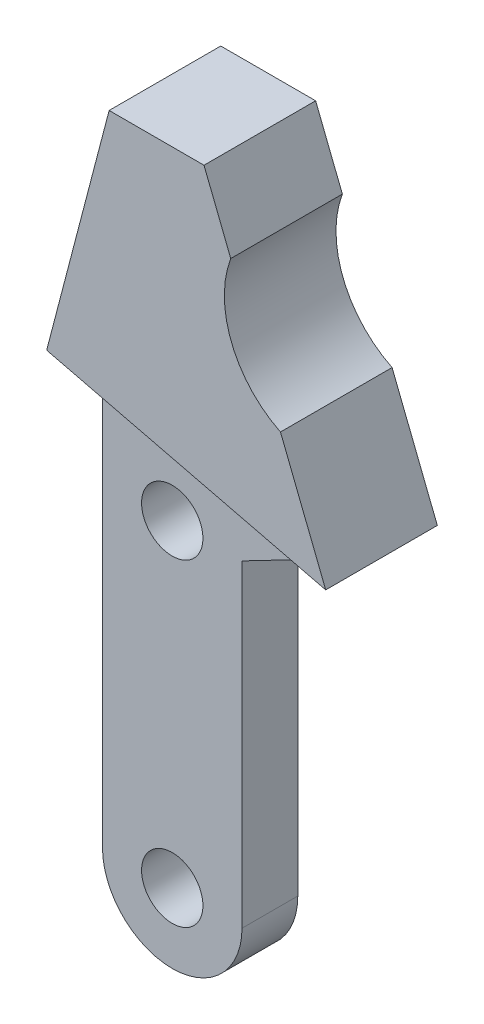
ISO-10303-21;
HEADER;
FILE_DESCRIPTION(('STEP AP214'),'2;1');
FILE_NAME('part.step','',(''),(''),'','','');
FILE_SCHEMA(('AUTOMOTIVE_DESIGN { 1 0 10303 214 1 1 1 1 }'));
ENDSEC;
DATA;
#1=APPLICATION_CONTEXT('core data for automotive mechanical design processes');
#2=APPLICATION_PROTOCOL_DEFINITION('international standard','automotive_design',2000,#1);
#3=PRODUCT_CONTEXT('',#1,'mechanical');
#4=PRODUCT('Part','Part','',(#3));
#5=PRODUCT_RELATED_PRODUCT_CATEGORY('part','',(#4));
#6=PRODUCT_DEFINITION_FORMATION('','',#4);
#7=PRODUCT_DEFINITION_CONTEXT('part definition',#1,'design');
#8=PRODUCT_DEFINITION('design','',#6,#7);
#9=PRODUCT_DEFINITION_SHAPE('','',#8);
#10=(LENGTH_UNIT() NAMED_UNIT(*) SI_UNIT(.MILLI.,.METRE.));
#11=(NAMED_UNIT(*) PLANE_ANGLE_UNIT() SI_UNIT($,.RADIAN.));
#12=(NAMED_UNIT(*) SI_UNIT($,.STERADIAN.) SOLID_ANGLE_UNIT());
#13=UNCERTAINTY_MEASURE_WITH_UNIT(LENGTH_MEASURE(1.E-05),#10,'distance_accuracy_value','');
#14=(GEOMETRIC_REPRESENTATION_CONTEXT(3) GLOBAL_UNCERTAINTY_ASSIGNED_CONTEXT((#13)) GLOBAL_UNIT_ASSIGNED_CONTEXT((#10,
#11,#12)) REPRESENTATION_CONTEXT('',''));
#15=CARTESIAN_POINT('',(0.,0.,0.));
#16=DIRECTION('',(0.,0.,1.));
#17=DIRECTION('',(1.,0.,0.));
#18=AXIS2_PLACEMENT_3D('',#15,#16,#17);
#19=CARTESIAN_POINT('',(0.810873608132944,13.97,5.08));
#20=DIRECTION('',(-0.929593890910039,-0.368585401206741,0.));
#21=DIRECTION('',(0.368585401206741,-0.929593890910039,0.));
#22=AXIS2_PLACEMENT_3D('',#19,#20,#21);
#23=PLANE('',#22);
#24=DIRECTION('',(-0.368585401206741,0.929593890910039,0.));
#25=VECTOR('',#24,1.);
#26=CARTESIAN_POINT('',(0.810873608132944,13.97,0.));
#27=LINE('',#26,#25);
#28=CARTESIAN_POINT('',(6.35,0.,0.));
#29=VERTEX_POINT('',#28);
#30=CARTESIAN_POINT('',(4.29034477805673,5.1945706624053,0.));
#31=VERTEX_POINT('',#30);
#32=EDGE_CURVE('E133',#29,#31,#27,.T.);
#33=ORIENTED_EDGE('',*,*,#32,.T.);
#34=DIRECTION('',(0.,0.,1.));
#35=VECTOR('',#34,1.);
#36=CARTESIAN_POINT('',(4.29034477805673,5.1945706624053,0.));
#37=LINE('',#36,#35);
#38=CARTESIAN_POINT('',(4.29034477805673,5.1945706624053,5.08));
#39=VERTEX_POINT('',#38);
#40=EDGE_CURVE('E117',#31,#39,#37,.T.);
#41=ORIENTED_EDGE('',*,*,#40,.T.);
#42=DIRECTION('',(-0.368585401206741,0.929593890910039,0.));
#43=VECTOR('',#42,1.);
#44=CARTESIAN_POINT('',(0.810873608132944,13.97,5.08));
#45=LINE('',#44,#43);
#46=CARTESIAN_POINT('',(6.35,0.,5.08));
#47=VERTEX_POINT('',#46);
#48=EDGE_CURVE('E221',#47,#39,#45,.T.);
#49=ORIENTED_EDGE('',*,*,#48,.F.);
#50=DIRECTION('',(0.,0.,-1.));
#51=VECTOR('',#50,1.);
#52=CARTESIAN_POINT('',(6.35,0.,5.08));
#53=LINE('',#52,#51);
#54=CARTESIAN_POINT('',(6.35,0.,2.54));
#55=VERTEX_POINT('',#54);
#56=EDGE_CURVE('E164',#47,#55,#53,.T.);
#57=ORIENTED_EDGE('',*,*,#56,.T.);
#58=EDGE_CURVE('E139',#55,#29,#53,.T.);
#59=ORIENTED_EDGE('',*,*,#58,.T.);
#60=EDGE_LOOP('',(#33,#41,#49,#57,#59));
#61=FACE_BOUND('',#60,.T.);
#62=ADVANCED_FACE('F41',(#61),#23,.F.);
#63=CARTESIAN_POINT('',(-6.35,-17.78,5.08));
#64=DIRECTION('',(1.,0.,0.));
#65=DIRECTION('',(0.,0.,-1.));
#66=AXIS2_PLACEMENT_3D('',#63,#64,#65);
#67=PLANE('',#66);
#68=DIRECTION('',(0.,-1.,0.));
#69=VECTOR('',#68,1.);
#70=CARTESIAN_POINT('',(-6.35,3.09929062326937,2.54));
#71=LINE('',#70,#69);
#72=CARTESIAN_POINT('',(-6.35,3.09929062326937,2.54));
#73=VERTEX_POINT('',#72);
#74=CARTESIAN_POINT('',(-6.35,-17.78,2.54));
#75=VERTEX_POINT('',#74);
#76=EDGE_CURVE('E193',#73,#75,#71,.T.);
#77=ORIENTED_EDGE('',*,*,#76,.F.);
#78=DIRECTION('',(0.,0.,-1.));
#79=VECTOR('',#78,1.);
#80=CARTESIAN_POINT('',(-6.35,3.09929062326937,5.08));
#81=LINE('',#80,#79);
#82=CARTESIAN_POINT('',(-6.35,3.09929062326937,0.));
#83=VERTEX_POINT('',#82);
#84=EDGE_CURVE('E172',#73,#83,#81,.T.);
#85=ORIENTED_EDGE('',*,*,#84,.T.);
#86=DIRECTION('',(0.,-1.,0.));
#87=VECTOR('',#86,1.);
#88=CARTESIAN_POINT('',(-6.35,-17.78,0.));
#89=LINE('',#88,#87);
#90=CARTESIAN_POINT('',(-6.35,-17.78,0.));
#91=VERTEX_POINT('',#90);
#92=EDGE_CURVE('E152',#83,#91,#89,.T.);
#93=ORIENTED_EDGE('',*,*,#92,.T.);
#94=DIRECTION('',(0.,0.,-1.));
#95=VECTOR('',#94,1.);
#96=CARTESIAN_POINT('',(-6.35,-17.78,5.08));
#97=LINE('',#96,#95);
#98=EDGE_CURVE('E170',#75,#91,#97,.T.);
#99=ORIENTED_EDGE('',*,*,#98,.F.);
#100=EDGE_LOOP('',(#77,#85,#93,#99));
#101=FACE_BOUND('',#100,.T.);
#102=ADVANCED_FACE('F192',(#101),#67,.F.);
#103=CARTESIAN_POINT('',(-3.175,-17.78,5.08));
#104=DIRECTION('',(0.,0.,-1.));
#105=DIRECTION('',(-1.,0.,0.));
#106=AXIS2_PLACEMENT_3D('',#103,#104,#105);
#107=CYLINDRICAL_SURFACE('',#106,3.175);
#108=CARTESIAN_POINT('',(-3.175,-17.78,2.54));
#109=DIRECTION('',(0.,0.,1.));
#110=DIRECTION('',(1.,0.,0.));
#111=AXIS2_PLACEMENT_3D('',#108,#109,#110);
#112=CIRCLE('',#111,3.175);
#113=CARTESIAN_POINT('',(0.,-17.78,2.54));
#114=VERTEX_POINT('',#113);
#115=EDGE_CURVE('E214',#75,#114,#112,.T.);
#116=ORIENTED_EDGE('',*,*,#115,.F.);
#117=ORIENTED_EDGE('',*,*,#98,.T.);
#118=CARTESIAN_POINT('',(-3.175,-17.78,0.));
#119=DIRECTION('',(0.,0.,1.));
#120=DIRECTION('',(1.,0.,0.));
#121=AXIS2_PLACEMENT_3D('',#118,#119,#120);
#122=CIRCLE('',#121,3.175);
#123=CARTESIAN_POINT('',(0.,-17.78,0.));
#124=VERTEX_POINT('',#123);
#125=EDGE_CURVE('E155',#91,#124,#122,.T.);
#126=ORIENTED_EDGE('',*,*,#125,.T.);
#127=DIRECTION('',(0.,0.,-1.));
#128=VECTOR('',#127,1.);
#129=CARTESIAN_POINT('',(0.,-17.78,5.08));
#130=LINE('',#129,#128);
#131=EDGE_CURVE('E168',#114,#124,#130,.T.);
#132=ORIENTED_EDGE('',*,*,#131,.F.);
#133=EDGE_LOOP('',(#116,#117,#126,#132));
#134=FACE_BOUND('',#133,.T.);
#135=ADVANCED_FACE('F242',(#134),#107,.T.);
#136=CARTESIAN_POINT('',(0.,-17.78,5.08));
#137=DIRECTION('',(-1.,0.,0.));
#138=DIRECTION('',(0.,0.,1.));
#139=AXIS2_PLACEMENT_3D('',#136,#137,#138);
#140=PLANE('',#139);
#141=DIRECTION('',(0.,1.,0.));
#142=VECTOR('',#141,1.);
#143=CARTESIAN_POINT('',(0.,-17.78,2.54));
#144=LINE('',#143,#142);
#145=CARTESIAN_POINT('',(0.,-3.302,2.54));
#146=VERTEX_POINT('',#145);
#147=EDGE_CURVE('E65',#114,#146,#144,.T.);
#148=ORIENTED_EDGE('',*,*,#147,.F.);
#149=ORIENTED_EDGE('',*,*,#131,.T.);
#150=DIRECTION('',(0.,1.,0.));
#151=VECTOR('',#150,1.);
#152=CARTESIAN_POINT('',(0.,-17.78,0.));
#153=LINE('',#152,#151);
#154=CARTESIAN_POINT('',(0.,-3.302,0.));
#155=VERTEX_POINT('',#154);
#156=EDGE_CURVE('E158',#124,#155,#153,.T.);
#157=ORIENTED_EDGE('',*,*,#156,.T.);
#158=DIRECTION('',(0.,0.,-1.));
#159=VECTOR('',#158,1.);
#160=CARTESIAN_POINT('',(0.,-3.302,5.08));
#161=LINE('',#160,#159);
#162=EDGE_CURVE('E166',#146,#155,#161,.T.);
#163=ORIENTED_EDGE('',*,*,#162,.F.);
#164=EDGE_LOOP('',(#148,#149,#157,#163));
#165=FACE_BOUND('',#164,.T.);
#166=ADVANCED_FACE('F247',(#165),#140,.F.);
#167=CARTESIAN_POINT('',(0.,-3.302,5.08));
#168=DIRECTION('',(-0.461352736641989,0.887216801234595,0.));
#169=DIRECTION('',(-0.887216801234595,-0.46135273664199,0.));
#170=AXIS2_PLACEMENT_3D('',#167,#168,#169);
#171=PLANE('',#170);
#172=DIRECTION('',(0.887216801234595,0.46135273664199,0.));
#173=VECTOR('',#172,1.);
#174=CARTESIAN_POINT('',(0.,-3.302,2.54));
#175=LINE('',#174,#173);
#176=EDGE_CURVE('E203',#146,#55,#175,.T.);
#177=ORIENTED_EDGE('',*,*,#176,.F.);
#178=ORIENTED_EDGE('',*,*,#162,.T.);
#179=DIRECTION('',(0.887216801234595,0.461352736641989,0.));
#180=VECTOR('',#179,1.);
#181=CARTESIAN_POINT('',(0.,-3.302,0.));
#182=LINE('',#181,#180);
#183=EDGE_CURVE('E161',#155,#29,#182,.T.);
#184=ORIENTED_EDGE('',*,*,#183,.T.);
#185=ORIENTED_EDGE('',*,*,#58,.F.);
#186=EDGE_LOOP('',(#177,#178,#184,#185));
#187=FACE_BOUND('',#186,.T.);
#188=ADVANCED_FACE('F253',(#187),#171,.F.);
#189=CARTESIAN_POINT('',(-3.175,-17.78,5.08));
#190=DIRECTION('',(0.,0.,-1.));
#191=DIRECTION('',(-1.,0.,0.));
#192=AXIS2_PLACEMENT_3D('',#189,#190,#191);
#193=CYLINDRICAL_SURFACE('',#192,1.397);
#194=CARTESIAN_POINT('',(-3.175,-17.78,0.));
#195=DIRECTION('',(0.,0.,1.));
#196=DIRECTION('',(1.,0.,0.));
#197=AXIS2_PLACEMENT_3D('',#194,#195,#196);
#198=CIRCLE('',#197,1.397);
#199=CARTESIAN_POINT('',(-1.778,-17.78,0.));
#200=VERTEX_POINT('',#199);
#201=EDGE_CURVE('E145',#200,#200,#198,.T.);
#202=ORIENTED_EDGE('',*,*,#201,.F.);
#203=EDGE_LOOP('',(#202));
#204=FACE_BOUND('',#203,.T.);
#205=CARTESIAN_POINT('',(-3.175,-17.78,2.54));
#206=DIRECTION('',(0.,0.,1.));
#207=DIRECTION('',(1.,0.,0.));
#208=AXIS2_PLACEMENT_3D('',#205,#206,#207);
#209=CIRCLE('',#208,1.397);
#210=CARTESIAN_POINT('',(-1.778,-17.78,2.54));
#211=VERTEX_POINT('',#210);
#212=EDGE_CURVE('E206',#211,#211,#209,.T.);
#213=ORIENTED_EDGE('',*,*,#212,.T.);
#214=EDGE_LOOP('',(#213));
#215=FACE_BOUND('',#214,.T.);
#216=ADVANCED_FACE('F257',(#204,#215),#193,.F.);
#217=CARTESIAN_POINT('',(-3.175,-3.302,5.08));
#218=DIRECTION('',(0.,0.,-1.));
#219=DIRECTION('',(-1.,0.,0.));
#220=AXIS2_PLACEMENT_3D('',#217,#218,#219);
#221=CYLINDRICAL_SURFACE('',#220,1.397);
#222=CARTESIAN_POINT('',(-3.175,-3.302,0.));
#223=DIRECTION('',(0.,0.,1.));
#224=DIRECTION('',(1.,0.,0.));
#225=AXIS2_PLACEMENT_3D('',#222,#223,#224);
#226=CIRCLE('',#225,1.397);
#227=CARTESIAN_POINT('',(-1.778,-3.302,0.));
#228=VERTEX_POINT('',#227);
#229=EDGE_CURVE('E216',#228,#228,#226,.T.);
#230=ORIENTED_EDGE('',*,*,#229,.F.);
#231=EDGE_LOOP('',(#230));
#232=FACE_BOUND('',#231,.T.);
#233=CARTESIAN_POINT('',(-3.175,-3.302,2.54));
#234=DIRECTION('',(0.,0.,1.));
#235=DIRECTION('',(1.,0.,0.));
#236=AXIS2_PLACEMENT_3D('',#233,#234,#235);
#237=CIRCLE('',#236,1.397);
#238=CARTESIAN_POINT('',(-1.778,-3.302,2.54));
#239=VERTEX_POINT('',#238);
#240=EDGE_CURVE('E45',#239,#239,#237,.T.);
#241=ORIENTED_EDGE('',*,*,#240,.T.);
#242=EDGE_LOOP('',(#241));
#243=FACE_BOUND('',#242,.T.);
#244=ADVANCED_FACE('F262',(#232,#243),#221,.F.);
#245=CARTESIAN_POINT('',(-3.175,-17.78,5.08));
#246=DIRECTION('',(0.,0.,1.));
#247=DIRECTION('',(1.,0.,0.));
#248=AXIS2_PLACEMENT_3D('',#245,#246,#247);
#249=PLANE('',#248);
#250=CARTESIAN_POINT('',(6.30938569441514,9.29660159574436,5.08));
#251=DIRECTION('',(0.,0.,1.));
#252=DIRECTION('',(1.,0.,0.));
#253=AXIS2_PLACEMENT_3D('',#250,#251,#252);
#254=CIRCLE('',#253,4.572);
#255=CARTESIAN_POINT('',(2.0279426029176,10.9004809722151,5.08));
#256=VERTEX_POINT('',#255);
#257=EDGE_CURVE('E120',#256,#39,#254,.T.);
#258=ORIENTED_EDGE('',*,*,#257,.F.);
#259=CARTESIAN_POINT('',(0.810873608132944,13.97,5.08));
#260=VERTEX_POINT('',#259);
#261=EDGE_CURVE('E163',#256,#260,#45,.T.);
#262=ORIENTED_EDGE('',*,*,#261,.T.);
#263=DIRECTION('',(-1.,0.,0.));
#264=VECTOR('',#263,1.);
#265=CARTESIAN_POINT('',(0.810873608132944,13.97,5.08));
#266=LINE('',#265,#264);
#267=CARTESIAN_POINT('',(-3.50712639186706,13.97,5.08));
#268=VERTEX_POINT('',#267);
#269=EDGE_CURVE('E222',#260,#268,#266,.T.);
#270=ORIENTED_EDGE('',*,*,#269,.T.);
#271=DIRECTION('',(-0.253008169129416,-0.967464142154003,0.));
#272=VECTOR('',#271,1.);
#273=CARTESIAN_POINT('',(-6.35,3.09929062326937,5.08));
#274=LINE('',#273,#272);
#275=CARTESIAN_POINT('',(-6.35,3.09929062326937,5.08));
#276=VERTEX_POINT('',#275);
#277=EDGE_CURVE('E147',#268,#276,#274,.T.);
#278=ORIENTED_EDGE('',*,*,#277,.T.);
#279=DIRECTION('',(-0.971489872002657,0.237081059125905,0.));
#280=VECTOR('',#279,1.);
#281=CARTESIAN_POINT('',(-6.35,3.09929062326937,5.08));
#282=LINE('',#281,#280);
#283=EDGE_CURVE('E200',#47,#276,#282,.T.);
#284=ORIENTED_EDGE('',*,*,#283,.F.);
#285=ORIENTED_EDGE('',*,*,#48,.T.);
#286=EDGE_LOOP('',(#258,#262,#270,#278,#284,#285));
#287=FACE_BOUND('',#286,.T.);
#288=ADVANCED_FACE('F224',(#287),#249,.T.);
#289=CARTESIAN_POINT('',(-3.175,-17.78,0.));
#290=DIRECTION('',(0.,0.,1.));
#291=DIRECTION('',(1.,0.,0.));
#292=AXIS2_PLACEMENT_3D('',#289,#290,#291);
#293=PLANE('',#292);
#294=CARTESIAN_POINT('',(2.0279426029176,10.9004809722151,0.));
#295=VERTEX_POINT('',#294);
#296=CARTESIAN_POINT('',(0.810873608132944,13.97,0.));
#297=VERTEX_POINT('',#296);
#298=EDGE_CURVE('E135',#295,#297,#27,.T.);
#299=ORIENTED_EDGE('',*,*,#298,.F.);
#300=CARTESIAN_POINT('',(6.30938569441514,9.29660159574436,0.));
#301=DIRECTION('',(0.,0.,1.));
#302=DIRECTION('',(1.,0.,0.));
#303=AXIS2_PLACEMENT_3D('',#300,#301,#302);
#304=CIRCLE('',#303,4.572);
#305=EDGE_CURVE('E57',#295,#31,#304,.T.);
#306=ORIENTED_EDGE('',*,*,#305,.T.);
#307=ORIENTED_EDGE('',*,*,#32,.F.);
#308=ORIENTED_EDGE('',*,*,#183,.F.);
#309=ORIENTED_EDGE('',*,*,#156,.F.);
#310=ORIENTED_EDGE('',*,*,#125,.F.);
#311=ORIENTED_EDGE('',*,*,#92,.F.);
#312=DIRECTION('',(-0.253008169129416,-0.967464142154003,0.));
#313=VECTOR('',#312,1.);
#314=CARTESIAN_POINT('',(-6.35,3.09929062326937,0.));
#315=LINE('',#314,#313);
#316=CARTESIAN_POINT('',(-3.50712639186706,13.97,0.));
#317=VERTEX_POINT('',#316);
#318=EDGE_CURVE('E143',#317,#83,#315,.T.);
#319=ORIENTED_EDGE('',*,*,#318,.F.);
#320=DIRECTION('',(-1.,0.,0.));
#321=VECTOR('',#320,1.);
#322=CARTESIAN_POINT('',(0.810873608132944,13.97,0.));
#323=LINE('',#322,#321);
#324=EDGE_CURVE('E141',#297,#317,#323,.T.);
#325=ORIENTED_EDGE('',*,*,#324,.F.);
#326=EDGE_LOOP('',(#299,#306,#307,#308,#309,#310,#311,#319,#325));
#327=FACE_BOUND('',#326,.T.);
#328=ORIENTED_EDGE('',*,*,#201,.T.);
#329=EDGE_LOOP('',(#328));
#330=FACE_BOUND('',#329,.T.);
#331=ORIENTED_EDGE('',*,*,#229,.T.);
#332=EDGE_LOOP('',(#331));
#333=FACE_BOUND('',#332,.T.);
#334=ADVANCED_FACE('F130',(#327,#330,#333),#293,.F.);
#335=ORIENTED_EDGE('',*,*,#261,.F.);
#336=DIRECTION('',(0.,0.,1.));
#337=VECTOR('',#336,1.);
#338=CARTESIAN_POINT('',(2.0279426029176,10.9004809722151,0.));
#339=LINE('',#338,#337);
#340=EDGE_CURVE('E125',#295,#256,#339,.T.);
#341=ORIENTED_EDGE('',*,*,#340,.F.);
#342=ORIENTED_EDGE('',*,*,#298,.T.);
#343=DIRECTION('',(0.,0.,-1.));
#344=VECTOR('',#343,1.);
#345=CARTESIAN_POINT('',(0.810873608132944,13.97,5.08));
#346=LINE('',#345,#344);
#347=EDGE_CURVE('E11',#260,#297,#346,.T.);
#348=ORIENTED_EDGE('',*,*,#347,.F.);
#349=EDGE_LOOP('',(#335,#341,#342,#348));
#350=FACE_BOUND('',#349,.T.);
#351=ADVANCED_FACE('F43',(#350),#23,.F.);
#352=CARTESIAN_POINT('',(0.810873608132944,13.97,5.08));
#353=DIRECTION('',(0.,-1.,0.));
#354=DIRECTION('',(0.,0.,-1.));
#355=AXIS2_PLACEMENT_3D('',#352,#353,#354);
#356=PLANE('',#355);
#357=ORIENTED_EDGE('',*,*,#324,.T.);
#358=DIRECTION('',(0.,0.,-1.));
#359=VECTOR('',#358,1.);
#360=CARTESIAN_POINT('',(-3.50712639186706,13.97,5.08));
#361=LINE('',#360,#359);
#362=EDGE_CURVE('E50',#268,#317,#361,.T.);
#363=ORIENTED_EDGE('',*,*,#362,.F.);
#364=ORIENTED_EDGE('',*,*,#269,.F.);
#365=ORIENTED_EDGE('',*,*,#347,.T.);
#366=EDGE_LOOP('',(#357,#363,#364,#365));
#367=FACE_BOUND('',#366,.T.);
#368=ADVANCED_FACE('F229',(#367),#356,.F.);
#369=CARTESIAN_POINT('',(-6.35,3.09929062326937,5.08));
#370=DIRECTION('',(0.967464142154003,-0.253008169129416,0.));
#371=DIRECTION('',(0.253008169129416,0.967464142154003,0.));
#372=AXIS2_PLACEMENT_3D('',#369,#370,#371);
#373=PLANE('',#372);
#374=ORIENTED_EDGE('',*,*,#318,.T.);
#375=ORIENTED_EDGE('',*,*,#84,.F.);
#376=EDGE_CURVE('E173',#276,#73,#81,.T.);
#377=ORIENTED_EDGE('',*,*,#376,.F.);
#378=ORIENTED_EDGE('',*,*,#277,.F.);
#379=ORIENTED_EDGE('',*,*,#362,.T.);
#380=EDGE_LOOP('',(#374,#375,#377,#378,#379));
#381=FACE_BOUND('',#380,.T.);
#382=ADVANCED_FACE('F180',(#381),#373,.F.);
#383=CARTESIAN_POINT('',(0.,0.,2.54));
#384=DIRECTION('',(0.,0.,1.));
#385=DIRECTION('',(1.,0.,0.));
#386=AXIS2_PLACEMENT_3D('',#383,#384,#385);
#387=PLANE('',#386);
#388=ORIENTED_EDGE('',*,*,#212,.F.);
#389=EDGE_LOOP('',(#388));
#390=FACE_BOUND('',#389,.T.);
#391=ORIENTED_EDGE('',*,*,#240,.F.);
#392=EDGE_LOOP('',(#391));
#393=FACE_BOUND('',#392,.T.);
#394=ORIENTED_EDGE('',*,*,#115,.T.);
#395=ORIENTED_EDGE('',*,*,#147,.T.);
#396=ORIENTED_EDGE('',*,*,#176,.T.);
#397=DIRECTION('',(-0.971489872002657,0.237081059125905,0.));
#398=VECTOR('',#397,1.);
#399=CARTESIAN_POINT('',(-6.35,3.09929062326937,2.54));
#400=LINE('',#399,#398);
#401=EDGE_CURVE('E198',#55,#73,#400,.T.);
#402=ORIENTED_EDGE('',*,*,#401,.T.);
#403=ORIENTED_EDGE('',*,*,#76,.T.);
#404=EDGE_LOOP('',(#394,#395,#396,#402,#403));
#405=FACE_BOUND('',#404,.T.);
#406=ADVANCED_FACE('F201',(#390,#393,#405),#387,.T.);
#407=CARTESIAN_POINT('',(-6.35,3.09929062326937,2.54));
#408=DIRECTION('',(0.237081059125905,0.971489872002657,0.));
#409=DIRECTION('',(-0.971489872002657,0.237081059125905,0.));
#410=AXIS2_PLACEMENT_3D('',#407,#408,#409);
#411=PLANE('',#410);
#412=ORIENTED_EDGE('',*,*,#283,.T.);
#413=ORIENTED_EDGE('',*,*,#376,.T.);
#414=ORIENTED_EDGE('',*,*,#401,.F.);
#415=ORIENTED_EDGE('',*,*,#56,.F.);
#416=EDGE_LOOP('',(#412,#413,#414,#415));
#417=FACE_BOUND('',#416,.T.);
#418=ADVANCED_FACE('F197',(#417),#411,.F.);
#419=CARTESIAN_POINT('',(6.30938569441514,9.29660159574436,0.));
#420=DIRECTION('',(0.,0.,1.));
#421=DIRECTION('',(1.,0.,0.));
#422=AXIS2_PLACEMENT_3D('',#419,#420,#421);
#423=CYLINDRICAL_SURFACE('',#422,4.572);
#424=ORIENTED_EDGE('',*,*,#257,.T.);
#425=ORIENTED_EDGE('',*,*,#40,.F.);
#426=ORIENTED_EDGE('',*,*,#305,.F.);
#427=ORIENTED_EDGE('',*,*,#340,.T.);
#428=EDGE_LOOP('',(#424,#425,#426,#427));
#429=FACE_BOUND('',#428,.T.);
#430=ADVANCED_FACE('F118',(#429),#423,.F.);
#431=CLOSED_SHELL('',(#62,#102,#135,#166,#188,#216,#244,#288,#334,#351,#368,#382,#406,#418,#430));
#432=MANIFOLD_SOLID_BREP('B2',#431);
#433=ADVANCED_BREP_SHAPE_REPRESENTATION('',(#18,#432),#14);
#434=SHAPE_DEFINITION_REPRESENTATION(#9,#433);
ENDSEC;
END-ISO-10303-21;
